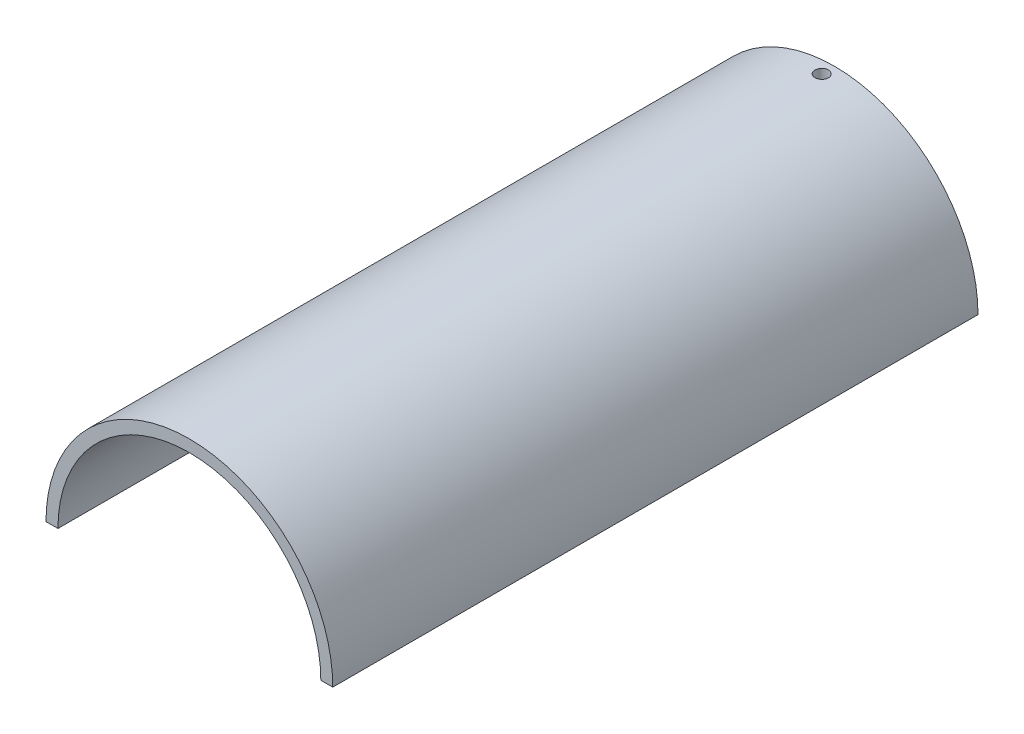
ISO-10303-21;
HEADER;
FILE_DESCRIPTION(('STEP AP214'),'2;1');
FILE_NAME('part.step','',(''),(''),'','','');
FILE_SCHEMA(('AUTOMOTIVE_DESIGN { 1 0 10303 214 1 1 1 1 }'));
ENDSEC;
DATA;
#1=APPLICATION_CONTEXT('core data for automotive mechanical design processes');
#2=APPLICATION_PROTOCOL_DEFINITION('international standard','automotive_design',2000,#1);
#3=PRODUCT_CONTEXT('',#1,'mechanical');
#4=PRODUCT('Part','Part','',(#3));
#5=PRODUCT_RELATED_PRODUCT_CATEGORY('part','',(#4));
#6=PRODUCT_DEFINITION_FORMATION('','',#4);
#7=PRODUCT_DEFINITION_CONTEXT('part definition',#1,'design');
#8=PRODUCT_DEFINITION('design','',#6,#7);
#9=PRODUCT_DEFINITION_SHAPE('','',#8);
#10=(LENGTH_UNIT() NAMED_UNIT(*) SI_UNIT(.MILLI.,.METRE.));
#11=(NAMED_UNIT(*) PLANE_ANGLE_UNIT() SI_UNIT($,.RADIAN.));
#12=(NAMED_UNIT(*) SI_UNIT($,.STERADIAN.) SOLID_ANGLE_UNIT());
#13=UNCERTAINTY_MEASURE_WITH_UNIT(LENGTH_MEASURE(1.E-05),#10,'distance_accuracy_value','');
#14=(GEOMETRIC_REPRESENTATION_CONTEXT(3) GLOBAL_UNCERTAINTY_ASSIGNED_CONTEXT((#13)) GLOBAL_UNIT_ASSIGNED_CONTEXT((#10,
#11,#12)) REPRESENTATION_CONTEXT('',''));
#15=CARTESIAN_POINT('',(0.,0.,0.));
#16=DIRECTION('',(0.,0.,1.));
#17=DIRECTION('',(1.,0.,0.));
#18=AXIS2_PLACEMENT_3D('',#15,#16,#17);
#19=CARTESIAN_POINT('',(0.,0.,171.45));
#20=DIRECTION('',(0.,0.,-1.));
#21=DIRECTION('',(-1.,0.,0.));
#22=AXIS2_PLACEMENT_3D('',#19,#20,#21);
#23=CYLINDRICAL_SURFACE('',#22,38.1);
#24=CARTESIAN_POINT('',(0.,38.1,5.23278099999999));
#25=CARTESIAN_POINT('',(-0.100261379367499,38.0999994391975,5.23277657243289));
#26=CARTESIAN_POINT('',(-0.200594054474525,38.0995999984818,5.22431003416241));
#27=CARTESIAN_POINT('',(-0.398492139424976,38.0980449506934,5.19065509160282));
#28=CARTESIAN_POINT('',(-0.496054138132966,38.0968884503776,5.16544693361501));
#29=CARTESIAN_POINT('',(-0.685515449718463,38.0939501938456,5.0990315768379));
#30=CARTESIAN_POINT('',(-0.777417599436229,38.0921687539111,5.0578324699391));
#31=CARTESIAN_POINT('',(-0.95297662339662,38.088181309793,4.96061698751939));
#32=CARTESIAN_POINT('',(-1.03663545009264,38.0859754065119,4.90460413230992));
#33=CARTESIAN_POINT('',(-1.19343387287702,38.0813849969848,4.77929439699734));
#34=CARTESIAN_POINT('',(-1.26656511061194,38.0790003510858,4.70998706248984));
#35=CARTESIAN_POINT('',(-1.40016129091754,38.0743224281116,4.5600763747939));
#36=CARTESIAN_POINT('',(-1.46062571856612,38.072029154754,4.47947256261136));
#37=CARTESIAN_POINT('',(-1.56719401182616,38.067791620518,4.3092143381789));
#38=CARTESIAN_POINT('',(-1.61329149494208,38.065847514919,4.21955592678714));
#39=CARTESIAN_POINT('',(-1.68977636973584,38.0625292094864,4.03376176094169));
#40=CARTESIAN_POINT('',(-1.72016386997266,38.0611550057149,3.93762605125257));
#41=CARTESIAN_POINT('',(-1.76434449850707,38.0591327067108,3.7416818240663));
#42=CARTESIAN_POINT('',(-1.77814992364926,38.0584840734383,3.64187608484841));
#43=CARTESIAN_POINT('',(-1.78881245054596,38.057984443156,3.44136182393644));
#44=CARTESIAN_POINT('',(-1.78566967353959,38.0581334404403,3.3406533087055));
#45=CARTESIAN_POINT('',(-1.76253526569804,38.0592117688739,3.14127578469632));
#46=CARTESIAN_POINT('',(-1.7425569185862,38.0601404848018,3.04260523077732));
#47=CARTESIAN_POINT('',(-1.68633906294748,38.062672602748,2.85001988831049));
#48=CARTESIAN_POINT('',(-1.65009949191223,38.0642760073598,2.7561051180455));
#49=CARTESIAN_POINT('',(-1.56237270901775,38.0679774884542,2.57565443122769));
#50=CARTESIAN_POINT('',(-1.51087943458915,38.070075761554,2.48912146621209));
#51=CARTESIAN_POINT('',(-1.39411137575484,38.0745302746026,2.32592303473035));
#52=CARTESIAN_POINT('',(-1.32883650651568,38.0768865161392,2.24925762900924));
#53=CARTESIAN_POINT('',(-1.18628317743886,38.0815941209938,2.10789324141974));
#54=CARTESIAN_POINT('',(-1.10899321233916,38.0839454774239,2.04320586077891));
#55=CARTESIAN_POINT('',(-0.944644129333311,38.0883760946132,1.92772314012245));
#56=CARTESIAN_POINT('',(-0.857585009206015,38.0904553553104,1.87692780326537));
#57=CARTESIAN_POINT('',(-0.676162177618464,38.094107513859,1.79067220707046));
#58=CARTESIAN_POINT('',(-0.581798276968834,38.0956803985901,1.75521234506888));
#59=CARTESIAN_POINT('',(-0.388447515937931,38.0981423372629,1.7006418226423));
#60=CARTESIAN_POINT('',(-0.289460686002334,38.0990313957076,1.68153105456149));
#61=CARTESIAN_POINT('',(-0.0897746694896748,38.1000249013278,1.660215487193));
#62=CARTESIAN_POINT('',(0.0109228005066334,38.1001300932903,1.65799463998794));
#63=CARTESIAN_POINT('',(0.211260203498929,38.0995459868138,1.6704800874365));
#64=CARTESIAN_POINT('',(0.310900139561169,38.0988566906791,1.68518633299758));
#65=CARTESIAN_POINT('',(0.506249140214955,38.0967617335549,1.73109522769821));
#66=CARTESIAN_POINT('',(0.601959928724324,38.0953563904414,1.76229055703945));
#67=CARTESIAN_POINT('',(0.786786832400232,38.0919875876488,1.84028467826303));
#68=CARTESIAN_POINT('',(0.875902914243008,38.0900241251497,1.88708354898516));
#69=CARTESIAN_POINT('',(1.04508445021649,38.0857581653277,1.99499743908206));
#70=CARTESIAN_POINT('',(1.12514303075607,38.0834554135345,2.05612322429437));
#71=CARTESIAN_POINT('',(1.27386789882792,38.0787710938787,2.19094006349502));
#72=CARTESIAN_POINT('',(1.34253412162551,38.0763895255684,2.26463118887843));
#73=CARTESIAN_POINT('',(1.46657904307266,38.0718138888832,2.42255587758306));
#74=CARTESIAN_POINT('',(1.52194736441588,38.0696199677969,2.50679759679878));
#75=CARTESIAN_POINT('',(1.6177538605611,38.0656693284917,2.68339089179136));
#76=CARTESIAN_POINT('',(1.6581920944543,38.0639126085422,2.77574243546887));
#77=CARTESIAN_POINT('',(1.72297240535935,38.0610355137335,2.96589529503426));
#78=CARTESIAN_POINT('',(1.74732111624136,38.0599148766378,3.06369434680322));
#79=CARTESIAN_POINT('',(1.77925291521413,38.0584355759097,3.26199780882728));
#80=CARTESIAN_POINT('',(1.78683608323175,38.0580769086447,3.3625022061828));
#81=CARTESIAN_POINT('',(1.78502076036678,38.0581620859976,3.5632600608456));
#82=CARTESIAN_POINT('',(1.77563859858268,38.0586051589422,3.6635136665452));
#83=CARTESIAN_POINT('',(1.74019267062953,38.0602422475968,3.86102079762397));
#84=CARTESIAN_POINT('',(1.7141288723849,38.0614362647507,3.95827431723417));
#85=CARTESIAN_POINT('',(1.64606275686974,38.0644404935142,4.14702431081004));
#86=CARTESIAN_POINT('',(1.60406028510408,38.0662507110967,4.23852072896152));
#87=CARTESIAN_POINT('',(1.50531215728027,38.0702832462095,4.41316364165571));
#88=CARTESIAN_POINT('',(1.44856696880992,38.0725055506692,4.49631040090468));
#89=CARTESIAN_POINT('',(1.32188650440524,38.0771141958297,4.65197482601974));
#90=CARTESIAN_POINT('',(1.25194001058454,38.0795006749347,4.724483358165));
#91=CARTESIAN_POINT('',(1.10084672956274,38.0841677933682,4.85675088608653));
#92=CARTESIAN_POINT('',(1.01969718788042,38.0864484064828,4.9165067371478));
#93=CARTESIAN_POINT('',(0.848443750628787,38.0906482133748,5.02159719223419));
#94=CARTESIAN_POINT('',(0.758331871231737,38.0925670804158,5.06691878417274));
#95=CARTESIAN_POINT('',(0.571836732325932,38.0958221371907,5.14173545492768));
#96=CARTESIAN_POINT('',(0.475461046078146,38.0971590160522,5.17124926121298));
#97=CARTESIAN_POINT('',(0.315403877000496,38.0987451546476,5.20585588904564));
#98=CARTESIAN_POINT('',(0.252759542014687,38.0992136586052,5.21593995031114));
#99=CARTESIAN_POINT('',(0.12675297106098,38.0998412584513,5.22940390296919));
#100=CARTESIAN_POINT('',(0.0633907356273176,38.10000035457,5.23278379935042));
#101=CARTESIAN_POINT('',(0.,38.1,5.23278099999999));
#102=B_SPLINE_CURVE_WITH_KNOTS('',3,(#24,#25,#26,#27,#28,#29,#30,#31,#32,#33,#34,#35,#36,#37,
#38,#39,#40,#41,#42,#43,#44,#45,#46,#47,#48,#49,#50,#51,#52,#53,#54,#55,#56,#57,#58,#59,#60,#61,
#62,#63,#64,#65,#66,#67,#68,#69,#70,#71,#72,#73,#74,#75,#76,#77,#78,#79,#80,#81,#82,#83,#84,#85,
#86,#87,#88,#89,#90,#91,#92,#93,#94,#95,#96,#97,#98,#99,#100,#101),.UNSPECIFIED.,.T.,.F.,(4,2,2,
2,2,2,2,2,2,2,2,2,2,2,2,2,2,2,2,2,2,2,2,2,2,2,2,2,2,2,2,2,2,2,2,2,2,2,4),(0.,0.300552741217909,
0.60146074084827,0.902216670281477,1.20290119275821,1.5038231416715,1.80475732107555,
2.10582500014169,2.40689059874482,2.70773279665209,3.00857284248487,3.30917573934219,
3.60977979173108,3.91050347957137,4.21122901858855,4.51224431677138,4.81325968339413,
5.11428284874193,5.41530403189168,5.71603916471764,6.01677342534313,6.31737429664887,
6.61797668681945,6.91880569041104,7.21963640334157,7.52070111877009,7.82176464261348,
8.12270395739321,8.42364183749275,8.72429021960067,9.02493917979948,9.32559105429302,
9.62623339431671,9.92713236664035,10.2281054528651,10.5293490950584,10.830235060348,
11.0202611068465,11.2102870119438),.UNSPECIFIED.);
#103=CARTESIAN_POINT('',(0.,38.1,5.23278099999999));
#104=VERTEX_POINT('',#103);
#105=EDGE_CURVE('E11',#104,#104,#102,.T.);
#106=ORIENTED_EDGE('',*,*,#105,.T.);
#107=EDGE_LOOP('',(#106));
#108=FACE_BOUND('',#107,.T.);
#109=CARTESIAN_POINT('',(0.,0.,0.));
#110=DIRECTION('',(0.,0.,1.));
#111=DIRECTION('',(1.,0.,0.));
#112=AXIS2_PLACEMENT_3D('',#109,#110,#111);
#113=CIRCLE('',#112,38.1);
#114=CARTESIAN_POINT('',(38.1,0.,0.));
#115=VERTEX_POINT('',#114);
#116=CARTESIAN_POINT('',(-38.1,0.,0.));
#117=VERTEX_POINT('',#116);
#118=EDGE_CURVE('E103',#115,#117,#113,.T.);
#119=ORIENTED_EDGE('',*,*,#118,.T.);
#120=DIRECTION('',(0.,0.,-1.));
#121=VECTOR('',#120,1.);
#122=CARTESIAN_POINT('',(-38.1,0.,171.45));
#123=LINE('',#122,#121);
#124=CARTESIAN_POINT('',(-38.1,0.,171.45));
#125=VERTEX_POINT('',#124);
#126=EDGE_CURVE('E45',#125,#117,#123,.T.);
#127=ORIENTED_EDGE('',*,*,#126,.F.);
#128=CARTESIAN_POINT('',(0.,0.,171.45));
#129=DIRECTION('',(0.,0.,1.));
#130=DIRECTION('',(1.,0.,0.));
#131=AXIS2_PLACEMENT_3D('',#128,#129,#130);
#132=CIRCLE('',#131,38.1);
#133=CARTESIAN_POINT('',(38.1,0.,171.45));
#134=VERTEX_POINT('',#133);
#135=EDGE_CURVE('E89',#134,#125,#132,.T.);
#136=ORIENTED_EDGE('',*,*,#135,.F.);
#137=DIRECTION('',(0.,0.,-1.));
#138=VECTOR('',#137,1.);
#139=CARTESIAN_POINT('',(38.1,0.,171.45));
#140=LINE('',#139,#138);
#141=EDGE_CURVE('E99',#134,#115,#140,.T.);
#142=ORIENTED_EDGE('',*,*,#141,.T.);
#143=EDGE_LOOP('',(#119,#127,#136,#142));
#144=FACE_BOUND('',#143,.T.);
#145=ADVANCED_FACE('F33',(#108,#144),#23,.T.);
#146=CARTESIAN_POINT('',(-38.1,0.,171.45));
#147=DIRECTION('',(0.,1.,0.));
#148=DIRECTION('',(-1.,0.,0.));
#149=AXIS2_PLACEMENT_3D('',#146,#147,#148);
#150=PLANE('',#149);
#151=DIRECTION('',(1.,0.,0.));
#152=VECTOR('',#151,1.);
#153=CARTESIAN_POINT('',(-38.1,0.,0.));
#154=LINE('',#153,#152);
#155=CARTESIAN_POINT('',(-34.925,0.,0.));
#156=VERTEX_POINT('',#155);
#157=EDGE_CURVE('E94',#117,#156,#154,.T.);
#158=ORIENTED_EDGE('',*,*,#157,.T.);
#159=DIRECTION('',(0.,0.,-1.));
#160=VECTOR('',#159,1.);
#161=CARTESIAN_POINT('',(-34.925,0.,171.45));
#162=LINE('',#161,#160);
#163=CARTESIAN_POINT('',(-34.925,0.,171.45));
#164=VERTEX_POINT('',#163);
#165=EDGE_CURVE('E92',#164,#156,#162,.T.);
#166=ORIENTED_EDGE('',*,*,#165,.F.);
#167=DIRECTION('',(1.,0.,0.));
#168=VECTOR('',#167,1.);
#169=CARTESIAN_POINT('',(-38.1,0.,171.45));
#170=LINE('',#169,#168);
#171=EDGE_CURVE('E84',#125,#164,#170,.T.);
#172=ORIENTED_EDGE('',*,*,#171,.F.);
#173=ORIENTED_EDGE('',*,*,#126,.T.);
#174=EDGE_LOOP('',(#158,#166,#172,#173));
#175=FACE_BOUND('',#174,.T.);
#176=ADVANCED_FACE('F93',(#175),#150,.F.);
#177=CARTESIAN_POINT('',(0.,0.,171.45));
#178=DIRECTION('',(0.,0.,-1.));
#179=DIRECTION('',(-1.,0.,0.));
#180=AXIS2_PLACEMENT_3D('',#177,#178,#179);
#181=CYLINDRICAL_SURFACE('',#180,34.925);
#182=CARTESIAN_POINT('',(0.,34.925,5.23278099999999));
#183=CARTESIAN_POINT('',(0.100250160551868,34.9249993893509,5.23277657671683));
#184=CARTESIAN_POINT('',(0.20057134181487,34.9245637343495,5.22431192546888));
#185=CARTESIAN_POINT('',(0.398445986618164,34.9228677023765,5.19066491544649));
#186=CARTESIAN_POINT('',(0.49599605129207,34.9216063546841,5.1654628789564));
#187=CARTESIAN_POINT('',(0.685433436496825,34.918401694903,5.09906473591368));
#188=CARTESIAN_POINT('',(0.777323623468033,34.9164587314125,5.05787680387358));
#189=CARTESIAN_POINT('',(0.952861085296512,34.9121096404833,4.96068866192902));
#190=CARTESIAN_POINT('',(1.0365102948723,34.9097036221487,4.90469194008417));
#191=CARTESIAN_POINT('',(1.19330397768876,34.9046962416008,4.77941040959447));
#192=CARTESIAN_POINT('',(1.26643872105193,34.9020947018022,4.71011342983769));
#193=CARTESIAN_POINT('',(1.40004449922371,34.8969910174903,4.56022285833603));
#194=CARTESIAN_POINT('',(1.46051501576688,34.8944888770481,4.47962880449972));
#195=CARTESIAN_POINT('',(1.56710298820945,34.8898648796106,4.30938035405635));
#196=CARTESIAN_POINT('',(1.61321279121087,34.8877432256329,4.21972116018495));
#197=CARTESIAN_POINT('',(1.68972136598796,34.8841216338138,4.03392127893981));
#198=CARTESIAN_POINT('',(1.72012026104875,34.8826216910937,3.93778064243332));
#199=CARTESIAN_POINT('',(1.76431825355277,34.8804142823289,3.74183694696768));
#200=CARTESIAN_POINT('',(1.77813198738536,34.879706117579,3.64203719745936));
#201=CARTESIAN_POINT('',(1.78881269690951,34.8791600259868,3.44153308433242));
#202=CARTESIAN_POINT('',(1.78567981109669,34.8793220920326,3.34082872811336));
#203=CARTESIAN_POINT('',(1.76256840039252,34.8804975367149,3.14147353480777));
#204=CARTESIAN_POINT('',(1.74260569162224,34.8815101160633,3.04282085877951));
#205=CARTESIAN_POINT('',(1.68642581469624,34.8842712021655,2.85026864356451));
#206=CARTESIAN_POINT('',(1.65020857549792,34.8860197121358,2.75636912515408));
#207=CARTESIAN_POINT('',(1.56252965863673,34.8900565105227,2.57593774698855));
#208=CARTESIAN_POINT('',(1.51106077321429,34.8923450540488,2.48940939571434));
#209=CARTESIAN_POINT('',(1.3943448254506,34.8972037216585,2.32621494713625));
#210=CARTESIAN_POINT('',(1.32909766114846,34.8997738478258,2.24954892282153));
#211=CARTESIAN_POINT('',(1.18658804424276,34.9049095581633,2.10816334265205));
#212=CARTESIAN_POINT('',(1.1093118960426,34.9074751337425,2.04345759015766));
#213=CARTESIAN_POINT('',(0.944986020207835,34.9123097418656,1.92793568645146));
#214=CARTESIAN_POINT('',(0.857936290096662,34.9145787743343,1.87711953875918));
#215=CARTESIAN_POINT('',(0.676526174209961,34.9185646816569,1.79082063961874));
#216=CARTESIAN_POINT('',(0.582165557293008,34.9202815390443,1.75533837320093));
#217=CARTESIAN_POINT('',(0.388815814658289,34.922969353054,1.70072348667881));
#218=CARTESIAN_POINT('',(0.289826725184491,34.9239403155162,1.68159073856967));
#219=CARTESIAN_POINT('',(0.090149800586193,34.9250261611472,1.66023501734027));
#220=CARTESIAN_POINT('',(-0.0105359876163317,34.9251420108635,1.65799295235614));
#221=CARTESIAN_POINT('',(-0.210853544320598,34.9245071412633,1.67043241299779));
#222=CARTESIAN_POINT('',(-0.310485316470431,34.9237564249472,1.6851138800296));
#223=CARTESIAN_POINT('',(-0.505813138393006,34.9214735970759,1.73096784925936));
#224=CARTESIAN_POINT('',(-0.601511240633632,34.9199418987523,1.76213163069399));
#225=CARTESIAN_POINT('',(-0.786318439501159,34.9162695447482,1.84005676054733));
#226=CARTESIAN_POINT('',(-0.87542749643629,34.9141288853997,1.88681820291548));
#227=CARTESIAN_POINT('',(-1.04461476888606,34.9094769920165,1.9946601256387));
#228=CARTESIAN_POINT('',(-1.12468482007398,34.9069654276194,2.05575340009936));
#229=CARTESIAN_POINT('',(-1.27343908782988,34.9018556606148,2.19050608610449));
#230=CARTESIAN_POINT('',(-1.34212322816417,34.8992574574275,2.26416558177864));
#231=CARTESIAN_POINT('',(-1.46622029140691,34.8942644962706,2.42204193787374));
#232=CARTESIAN_POINT('',(-1.52162085899762,34.8918699290324,2.50626851691177));
#233=CARTESIAN_POINT('',(-1.61749370762381,34.8875572665908,2.6828390708367));
#234=CARTESIAN_POINT('',(-1.65796605586196,34.8856391692426,2.7751830091792));
#235=CARTESIAN_POINT('',(-1.7228120736891,34.8824971053607,2.96532125529509));
#236=CARTESIAN_POINT('',(-1.74719361158716,34.8812727996085,3.06311287377845));
#237=CARTESIAN_POINT('',(-1.77919163792898,34.8796554273603,3.26140814688818));
#238=CARTESIAN_POINT('',(-1.78680822736537,34.8792623558568,3.36191178517357));
#239=CARTESIAN_POINT('',(-1.78505919294407,34.8793519016854,3.56265519332783));
#240=CARTESIAN_POINT('',(-1.77571300484601,34.8798335168118,3.66289513356547));
#241=CARTESIAN_POINT('',(-1.74034390530084,34.8816160367792,3.86038074888669));
#242=CARTESIAN_POINT('',(-1.7143209621832,34.8829169431761,3.95762641828353));
#243=CARTESIAN_POINT('',(-1.64634105878168,34.8861911977537,4.14636700361562));
#244=CARTESIAN_POINT('',(-1.60438399697271,34.8881645502189,4.23786188290507));
#245=CARTESIAN_POINT('',(-1.50573013802313,34.8925612276396,4.41251010342533));
#246=CARTESIAN_POINT('',(-1.44903378734779,34.8949845389648,4.49566369721486));
#247=CARTESIAN_POINT('',(-1.32244087844318,34.9000111853549,4.65136617759395));
#248=CARTESIAN_POINT('',(-1.25253071084092,34.9026147042541,4.72390399273377));
#249=CARTESIAN_POINT('',(-1.10150476624086,34.9077070036913,4.85623659613202));
#250=CARTESIAN_POINT('',(-1.02038623802268,34.9101957558578,4.91602824650744));
#251=CARTESIAN_POINT('',(-0.849180229267977,34.9147798705033,5.02120051514522));
#252=CARTESIAN_POINT('',(-0.759084030245025,34.9168748447619,5.06656694192645));
#253=CARTESIAN_POINT('',(-0.57261016320172,34.9204295896326,5.1414747525476));
#254=CARTESIAN_POINT('',(-0.476240061072589,34.921890109615,5.17103481527988));
#255=CARTESIAN_POINT('',(-0.316059959576571,34.9236253627032,5.20574291313207));
#256=CARTESIAN_POINT('',(-0.253287305870106,34.9241385841538,5.2158692373736));
#257=CARTESIAN_POINT('',(-0.127019273021757,34.9248260961206,5.2293896792092));
#258=CARTESIAN_POINT('',(-0.0635238945269294,34.9250003869401,5.23278380283014));
#259=CARTESIAN_POINT('',(0.,34.925,5.23278099999999));
#260=B_SPLINE_CURVE_WITH_KNOTS('',3,(#182,#183,#184,#185,#186,#187,#188,#189,#190,#191,#192,
#193,#194,#195,#196,#197,#198,#199,#200,#201,#202,#203,#204,#205,#206,#207,#208,#209,#210,#211,
#212,#213,#214,#215,#216,#217,#218,#219,#220,#221,#222,#223,#224,#225,#226,#227,#228,#229,#230,
#231,#232,#233,#234,#235,#236,#237,#238,#239,#240,#241,#242,#243,#244,#245,#246,#247,#248,#249,
#250,#251,#252,#253,#254,#255,#256,#257,#258,#259),.UNSPECIFIED.,.T.,.F.,(4,2,2,2,2,2,2,2,2,2,2,
2,2,2,2,2,2,2,2,2,2,2,2,2,2,2,2,2,2,2,2,2,2,2,2,2,2,2,4),(0.,0.300518594602272,0.6013911281628,
0.902110010479852,1.2027581245158,1.50368268586615,1.80461955972005,2.10571653105375,
2.40681113961225,2.7076398366883,3.00846607525664,3.30900992182432,3.60955508197163,
3.91024250357897,4.21093215038692,4.51196668570287,4.81300129729918,5.1140454303102,
5.41508720634338,5.71578865794218,6.01648906843187,6.31703053779549,6.61757381744433,
6.91838642162946,7.21920103980618,7.52029437566243,7.82138635606383,8.12233099499877,
8.42327382102798,8.72387204781396,9.02447084546259,9.32507155842489,9.62566316700348,
9.92656606924049,10.227542963185,10.5288150474598,10.8297303175053,11.0201552354493,
11.2105799829191),.UNSPECIFIED.);
#261=CARTESIAN_POINT('',(0.,34.925,5.23278099999999));
#262=VERTEX_POINT('',#261);
#263=EDGE_CURVE('E106',#262,#262,#260,.T.);
#264=ORIENTED_EDGE('',*,*,#263,.T.);
#265=EDGE_LOOP('',(#264));
#266=FACE_BOUND('',#265,.T.);
#267=CARTESIAN_POINT('',(0.,0.,0.));
#268=DIRECTION('',(0.,0.,-1.));
#269=DIRECTION('',(1.,0.,0.));
#270=AXIS2_PLACEMENT_3D('',#267,#268,#269);
#271=CIRCLE('',#270,34.925);
#272=CARTESIAN_POINT('',(34.925,0.,0.));
#273=VERTEX_POINT('',#272);
#274=EDGE_CURVE('E70',#156,#273,#271,.T.);
#275=ORIENTED_EDGE('',*,*,#274,.T.);
#276=DIRECTION('',(0.,0.,-1.));
#277=VECTOR('',#276,1.);
#278=CARTESIAN_POINT('',(34.925,0.,171.45));
#279=LINE('',#278,#277);
#280=CARTESIAN_POINT('',(34.925,0.,171.45));
#281=VERTEX_POINT('',#280);
#282=EDGE_CURVE('E95',#281,#273,#279,.T.);
#283=ORIENTED_EDGE('',*,*,#282,.F.);
#284=CARTESIAN_POINT('',(0.,0.,171.45));
#285=DIRECTION('',(0.,0.,-1.));
#286=DIRECTION('',(1.,0.,0.));
#287=AXIS2_PLACEMENT_3D('',#284,#285,#286);
#288=CIRCLE('',#287,34.925);
#289=EDGE_CURVE('E87',#164,#281,#288,.T.);
#290=ORIENTED_EDGE('',*,*,#289,.F.);
#291=ORIENTED_EDGE('',*,*,#165,.T.);
#292=EDGE_LOOP('',(#275,#283,#290,#291));
#293=FACE_BOUND('',#292,.T.);
#294=ADVANCED_FACE('F97',(#266,#293),#181,.F.);
#295=CARTESIAN_POINT('',(34.925,0.,171.45));
#296=DIRECTION('',(0.,1.,0.));
#297=DIRECTION('',(0.,0.,1.));
#298=AXIS2_PLACEMENT_3D('',#295,#296,#297);
#299=PLANE('',#298);
#300=DIRECTION('',(1.,0.,0.));
#301=VECTOR('',#300,1.);
#302=CARTESIAN_POINT('',(34.925,0.,0.));
#303=LINE('',#302,#301);
#304=EDGE_CURVE('E76',#273,#115,#303,.T.);
#305=ORIENTED_EDGE('',*,*,#304,.T.);
#306=ORIENTED_EDGE('',*,*,#141,.F.);
#307=DIRECTION('',(1.,0.,0.));
#308=VECTOR('',#307,1.);
#309=CARTESIAN_POINT('',(34.925,0.,171.45));
#310=LINE('',#309,#308);
#311=EDGE_CURVE('E53',#281,#134,#310,.T.);
#312=ORIENTED_EDGE('',*,*,#311,.F.);
#313=ORIENTED_EDGE('',*,*,#282,.T.);
#314=EDGE_LOOP('',(#305,#306,#312,#313));
#315=FACE_BOUND('',#314,.T.);
#316=ADVANCED_FACE('F123',(#315),#299,.F.);
#317=CARTESIAN_POINT('',(0.,0.,171.45));
#318=DIRECTION('',(0.,0.,1.));
#319=DIRECTION('',(1.,0.,0.));
#320=AXIS2_PLACEMENT_3D('',#317,#318,#319);
#321=PLANE('',#320);
#322=ORIENTED_EDGE('',*,*,#135,.T.);
#323=ORIENTED_EDGE('',*,*,#171,.T.);
#324=ORIENTED_EDGE('',*,*,#289,.T.);
#325=ORIENTED_EDGE('',*,*,#311,.T.);
#326=EDGE_LOOP('',(#322,#323,#324,#325));
#327=FACE_BOUND('',#326,.T.);
#328=ADVANCED_FACE('F85',(#327),#321,.T.);
#329=CARTESIAN_POINT('',(0.,0.,0.));
#330=DIRECTION('',(0.,0.,1.));
#331=DIRECTION('',(1.,0.,0.));
#332=AXIS2_PLACEMENT_3D('',#329,#330,#331);
#333=PLANE('',#332);
#334=ORIENTED_EDGE('',*,*,#118,.F.);
#335=ORIENTED_EDGE('',*,*,#304,.F.);
#336=ORIENTED_EDGE('',*,*,#274,.F.);
#337=ORIENTED_EDGE('',*,*,#157,.F.);
#338=EDGE_LOOP('',(#334,#335,#336,#337));
#339=FACE_BOUND('',#338,.T.);
#340=ADVANCED_FACE('F114',(#339),#333,.F.);
#341=CARTESIAN_POINT('',(0.,38.1,3.44678));
#342=DIRECTION('',(0.,1.,0.));
#343=DIRECTION('',(0.,0.,1.));
#344=AXIS2_PLACEMENT_3D('',#341,#342,#343);
#345=CYLINDRICAL_SURFACE('',#344,1.78600099999999);
#346=ORIENTED_EDGE('',*,*,#105,.F.);
#347=EDGE_LOOP('',(#346));
#348=FACE_BOUND('',#347,.T.);
#349=ORIENTED_EDGE('',*,*,#263,.F.);
#350=EDGE_LOOP('',(#349));
#351=FACE_BOUND('',#350,.T.);
#352=ADVANCED_FACE('F116',(#348,#351),#345,.F.);
#353=CLOSED_SHELL('',(#145,#176,#294,#316,#328,#340,#352));
#354=MANIFOLD_SOLID_BREP('B2',#353);
#355=ADVANCED_BREP_SHAPE_REPRESENTATION('',(#18,#354),#14);
#356=SHAPE_DEFINITION_REPRESENTATION(#9,#355);
ENDSEC;
END-ISO-10303-21;
